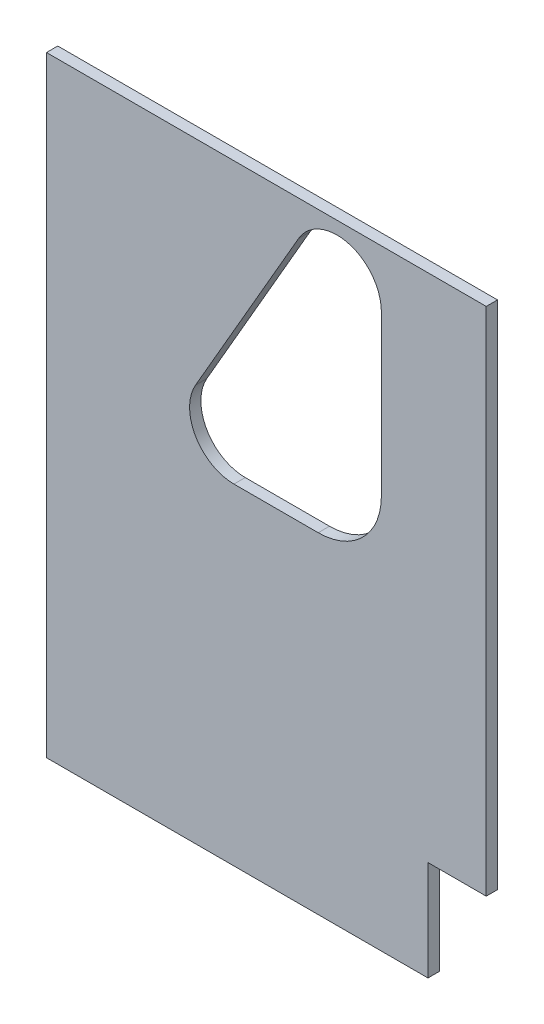
ISO-10303-21;
HEADER;
FILE_DESCRIPTION(('STEP AP214'),'2;1');
FILE_NAME('part.step','',(''),(''),'','','');
FILE_SCHEMA(('AUTOMOTIVE_DESIGN { 1 0 10303 214 1 1 1 1 }'));
ENDSEC;
DATA;
#1=APPLICATION_CONTEXT('core data for automotive mechanical design processes');
#2=APPLICATION_PROTOCOL_DEFINITION('international standard','automotive_design',2000,#1);
#3=PRODUCT_CONTEXT('',#1,'mechanical');
#4=PRODUCT('Part','Part','',(#3));
#5=PRODUCT_RELATED_PRODUCT_CATEGORY('part','',(#4));
#6=PRODUCT_DEFINITION_FORMATION('','',#4);
#7=PRODUCT_DEFINITION_CONTEXT('part definition',#1,'design');
#8=PRODUCT_DEFINITION('design','',#6,#7);
#9=PRODUCT_DEFINITION_SHAPE('','',#8);
#10=(LENGTH_UNIT() NAMED_UNIT(*) SI_UNIT(.MILLI.,.METRE.));
#11=(NAMED_UNIT(*) PLANE_ANGLE_UNIT() SI_UNIT($,.RADIAN.));
#12=(NAMED_UNIT(*) SI_UNIT($,.STERADIAN.) SOLID_ANGLE_UNIT());
#13=UNCERTAINTY_MEASURE_WITH_UNIT(LENGTH_MEASURE(1.E-05),#10,'distance_accuracy_value','');
#14=(GEOMETRIC_REPRESENTATION_CONTEXT(3) GLOBAL_UNCERTAINTY_ASSIGNED_CONTEXT((#13)) GLOBAL_UNIT_ASSIGNED_CONTEXT((#10,
#11,#12)) REPRESENTATION_CONTEXT('',''));
#15=CARTESIAN_POINT('',(0.,0.,0.));
#16=DIRECTION('',(0.,0.,1.));
#17=DIRECTION('',(1.,0.,0.));
#18=AXIS2_PLACEMENT_3D('',#15,#16,#17);
#19=CARTESIAN_POINT('',(0.,0.,30.));
#20=DIRECTION('',(1.,0.,0.));
#21=DIRECTION('',(0.,1.,0.));
#22=AXIS2_PLACEMENT_3D('',#19,#20,#21);
#23=PLANE('',#22);
#24=DIRECTION('',(0.,-1.,0.));
#25=VECTOR('',#24,1.);
#26=CARTESIAN_POINT('',(0.,0.,0.));
#27=LINE('',#26,#25);
#28=CARTESIAN_POINT('',(-4.44089209850063E-13,1625.,0.));
#29=VERTEX_POINT('',#28);
#30=CARTESIAN_POINT('',(0.,0.,0.));
#31=VERTEX_POINT('',#30);
#32=EDGE_CURVE('E184',#29,#31,#27,.T.);
#33=ORIENTED_EDGE('',*,*,#32,.T.);
#34=DIRECTION('',(0.,0.,-1.));
#35=VECTOR('',#34,1.);
#36=CARTESIAN_POINT('',(0.,0.,30.));
#37=LINE('',#36,#35);
#38=CARTESIAN_POINT('',(0.,0.,30.));
#39=VERTEX_POINT('',#38);
#40=EDGE_CURVE('E11',#39,#31,#37,.T.);
#41=ORIENTED_EDGE('',*,*,#40,.F.);
#42=DIRECTION('',(0.,-1.,0.));
#43=VECTOR('',#42,1.);
#44=CARTESIAN_POINT('',(0.,0.,30.));
#45=LINE('',#44,#43);
#46=CARTESIAN_POINT('',(-4.44089209850063E-13,1625.,30.));
#47=VERTEX_POINT('',#46);
#48=EDGE_CURVE('E185',#47,#39,#45,.T.);
#49=ORIENTED_EDGE('',*,*,#48,.F.);
#50=DIRECTION('',(0.,0.,-1.));
#51=VECTOR('',#50,1.);
#52=CARTESIAN_POINT('',(-4.44089209850063E-13,1625.,30.));
#53=LINE('',#52,#51);
#54=EDGE_CURVE('E199',#47,#29,#53,.T.);
#55=ORIENTED_EDGE('',*,*,#54,.T.);
#56=EDGE_LOOP('',(#33,#41,#49,#55));
#57=FACE_BOUND('',#56,.T.);
#58=ADVANCED_FACE('F40',(#57),#23,.F.);
#59=CARTESIAN_POINT('',(0.,0.,30.));
#60=DIRECTION('',(0.,1.,0.));
#61=DIRECTION('',(-1.,0.,0.));
#62=AXIS2_PLACEMENT_3D('',#59,#60,#61);
#63=PLANE('',#62);
#64=DIRECTION('',(1.,0.,0.));
#65=VECTOR('',#64,1.);
#66=CARTESIAN_POINT('',(0.,0.,0.));
#67=LINE('',#66,#65);
#68=CARTESIAN_POINT('',(1015.,0.,0.));
#69=VERTEX_POINT('',#68);
#70=EDGE_CURVE('E202',#31,#69,#67,.T.);
#71=ORIENTED_EDGE('',*,*,#70,.T.);
#72=DIRECTION('',(0.,0.,-1.));
#73=VECTOR('',#72,1.);
#74=CARTESIAN_POINT('',(1015.,0.,30.));
#75=LINE('',#74,#73);
#76=CARTESIAN_POINT('',(1015.,0.,30.));
#77=VERTEX_POINT('',#76);
#78=EDGE_CURVE('E47',#77,#69,#75,.T.);
#79=ORIENTED_EDGE('',*,*,#78,.F.);
#80=DIRECTION('',(1.,0.,0.));
#81=VECTOR('',#80,1.);
#82=CARTESIAN_POINT('',(0.,0.,30.));
#83=LINE('',#82,#81);
#84=EDGE_CURVE('E188',#39,#77,#83,.T.);
#85=ORIENTED_EDGE('',*,*,#84,.F.);
#86=ORIENTED_EDGE('',*,*,#40,.T.);
#87=EDGE_LOOP('',(#71,#79,#85,#86));
#88=FACE_BOUND('',#87,.T.);
#89=ADVANCED_FACE('F247',(#88),#63,.F.);
#90=CARTESIAN_POINT('',(1015.,266.,30.));
#91=DIRECTION('',(-1.,0.,0.));
#92=DIRECTION('',(0.,0.,1.));
#93=AXIS2_PLACEMENT_3D('',#90,#91,#92);
#94=PLANE('',#93);
#95=DIRECTION('',(0.,1.,0.));
#96=VECTOR('',#95,1.);
#97=CARTESIAN_POINT('',(1015.,266.,0.));
#98=LINE('',#97,#96);
#99=CARTESIAN_POINT('',(1015.,266.,0.));
#100=VERTEX_POINT('',#99);
#101=EDGE_CURVE('E204',#69,#100,#98,.T.);
#102=ORIENTED_EDGE('',*,*,#101,.T.);
#103=DIRECTION('',(0.,0.,-1.));
#104=VECTOR('',#103,1.);
#105=CARTESIAN_POINT('',(1015.,266.,30.));
#106=LINE('',#105,#104);
#107=CARTESIAN_POINT('',(1015.,266.,30.));
#108=VERTEX_POINT('',#107);
#109=EDGE_CURVE('E219',#108,#100,#106,.T.);
#110=ORIENTED_EDGE('',*,*,#109,.F.);
#111=DIRECTION('',(0.,1.,0.));
#112=VECTOR('',#111,1.);
#113=CARTESIAN_POINT('',(1015.,266.,30.));
#114=LINE('',#113,#112);
#115=EDGE_CURVE('E191',#77,#108,#114,.T.);
#116=ORIENTED_EDGE('',*,*,#115,.F.);
#117=ORIENTED_EDGE('',*,*,#78,.T.);
#118=EDGE_LOOP('',(#102,#110,#116,#117));
#119=FACE_BOUND('',#118,.T.);
#120=ADVANCED_FACE('F226',(#119),#94,.F.);
#121=CARTESIAN_POINT('',(1170.,266.,30.));
#122=DIRECTION('',(0.,1.,0.));
#123=DIRECTION('',(0.,0.,1.));
#124=AXIS2_PLACEMENT_3D('',#121,#122,#123);
#125=PLANE('',#124);
#126=DIRECTION('',(1.,0.,0.));
#127=VECTOR('',#126,1.);
#128=CARTESIAN_POINT('',(1170.,266.,0.));
#129=LINE('',#128,#127);
#130=CARTESIAN_POINT('',(1170.,266.,0.));
#131=VERTEX_POINT('',#130);
#132=EDGE_CURVE('E206',#100,#131,#129,.T.);
#133=ORIENTED_EDGE('',*,*,#132,.T.);
#134=DIRECTION('',(0.,0.,-1.));
#135=VECTOR('',#134,1.);
#136=CARTESIAN_POINT('',(1170.,266.,30.));
#137=LINE('',#136,#135);
#138=CARTESIAN_POINT('',(1170.,266.,30.));
#139=VERTEX_POINT('',#138);
#140=EDGE_CURVE('E216',#139,#131,#137,.T.);
#141=ORIENTED_EDGE('',*,*,#140,.F.);
#142=DIRECTION('',(1.,0.,0.));
#143=VECTOR('',#142,1.);
#144=CARTESIAN_POINT('',(1170.,266.,30.));
#145=LINE('',#144,#143);
#146=EDGE_CURVE('E193',#108,#139,#145,.T.);
#147=ORIENTED_EDGE('',*,*,#146,.F.);
#148=ORIENTED_EDGE('',*,*,#109,.T.);
#149=EDGE_LOOP('',(#133,#141,#147,#148));
#150=FACE_BOUND('',#149,.T.);
#151=ADVANCED_FACE('F235',(#150),#125,.F.);
#152=CARTESIAN_POINT('',(1170.,266.,30.));
#153=DIRECTION('',(-1.,0.,0.));
#154=DIRECTION('',(0.,-1.,0.));
#155=AXIS2_PLACEMENT_3D('',#152,#153,#154);
#156=PLANE('',#155);
#157=DIRECTION('',(0.,1.,0.));
#158=VECTOR('',#157,1.);
#159=CARTESIAN_POINT('',(1170.,266.,0.));
#160=LINE('',#159,#158);
#161=CARTESIAN_POINT('',(1170.,1625.,0.));
#162=VERTEX_POINT('',#161);
#163=EDGE_CURVE('E208',#131,#162,#160,.T.);
#164=ORIENTED_EDGE('',*,*,#163,.T.);
#165=DIRECTION('',(0.,0.,-1.));
#166=VECTOR('',#165,1.);
#167=CARTESIAN_POINT('',(1170.,1625.,30.));
#168=LINE('',#167,#166);
#169=CARTESIAN_POINT('',(1170.,1625.,30.));
#170=VERTEX_POINT('',#169);
#171=EDGE_CURVE('E213',#170,#162,#168,.T.);
#172=ORIENTED_EDGE('',*,*,#171,.F.);
#173=DIRECTION('',(0.,1.,0.));
#174=VECTOR('',#173,1.);
#175=CARTESIAN_POINT('',(1170.,266.,30.));
#176=LINE('',#175,#174);
#177=EDGE_CURVE('E195',#139,#170,#176,.T.);
#178=ORIENTED_EDGE('',*,*,#177,.F.);
#179=ORIENTED_EDGE('',*,*,#140,.T.);
#180=EDGE_LOOP('',(#164,#172,#178,#179));
#181=FACE_BOUND('',#180,.T.);
#182=ADVANCED_FACE('F239',(#181),#156,.F.);
#183=CARTESIAN_POINT('',(-4.44089209850063E-13,1625.,30.));
#184=DIRECTION('',(0.,-1.,0.));
#185=DIRECTION('',(0.,0.,-1.));
#186=AXIS2_PLACEMENT_3D('',#183,#184,#185);
#187=PLANE('',#186);
#188=DIRECTION('',(-1.,0.,0.));
#189=VECTOR('',#188,1.);
#190=CARTESIAN_POINT('',(-4.44089209850063E-13,1625.,0.));
#191=LINE('',#190,#189);
#192=EDGE_CURVE('E189',#162,#29,#191,.T.);
#193=ORIENTED_EDGE('',*,*,#192,.T.);
#194=ORIENTED_EDGE('',*,*,#54,.F.);
#195=DIRECTION('',(-1.,0.,0.));
#196=VECTOR('',#195,1.);
#197=CARTESIAN_POINT('',(-4.44089209850063E-13,1625.,30.));
#198=LINE('',#197,#196);
#199=EDGE_CURVE('E197',#170,#47,#198,.T.);
#200=ORIENTED_EDGE('',*,*,#199,.F.);
#201=ORIENTED_EDGE('',*,*,#171,.T.);
#202=EDGE_LOOP('',(#193,#194,#200,#201));
#203=FACE_BOUND('',#202,.T.);
#204=ADVANCED_FACE('F250',(#203),#187,.F.);
#205=CARTESIAN_POINT('',(0.,0.,30.));
#206=DIRECTION('',(0.,0.,-1.));
#207=DIRECTION('',(-1.,0.,0.));
#208=AXIS2_PLACEMENT_3D('',#205,#206,#207);
#209=PLANE('',#208);
#210=DIRECTION('',(0.,-1.,0.));
#211=VECTOR('',#210,1.);
#212=CARTESIAN_POINT('',(891.,0.,30.));
#213=LINE('',#212,#211);
#214=CARTESIAN_POINT('',(891.,1473.,30.));
#215=VERTEX_POINT('',#214);
#216=CARTESIAN_POINT('',(891.,1048.,30.));
#217=VERTEX_POINT('',#216);
#218=EDGE_CURVE('E159',#215,#217,#213,.T.);
#219=ORIENTED_EDGE('',*,*,#218,.T.);
#220=CARTESIAN_POINT('',(723.,1048.,30.));
#221=DIRECTION('',(0.,0.,-1.));
#222=DIRECTION('',(-1.,0.,0.));
#223=AXIS2_PLACEMENT_3D('',#220,#221,#222);
#224=CIRCLE('',#223,168.);
#225=CARTESIAN_POINT('',(723.,880.,30.));
#226=VERTEX_POINT('',#225);
#227=EDGE_CURVE('E134',#217,#226,#224,.T.);
#228=ORIENTED_EDGE('',*,*,#227,.T.);
#229=DIRECTION('',(-1.,0.,0.));
#230=VECTOR('',#229,1.);
#231=CARTESIAN_POINT('',(0.,880.,30.));
#232=LINE('',#231,#230);
#233=CARTESIAN_POINT('',(498.758622134924,880.,30.));
#234=VERTEX_POINT('',#233);
#235=EDGE_CURVE('E180',#226,#234,#232,.T.);
#236=ORIENTED_EDGE('',*,*,#235,.T.);
#237=CARTESIAN_POINT('',(498.758622134924,998.,30.));
#238=DIRECTION('',(0.,0.,-1.));
#239=DIRECTION('',(-1.,0.,0.));
#240=AXIS2_PLACEMENT_3D('',#237,#238,#239);
#241=CIRCLE('',#240,118.);
#242=CARTESIAN_POINT('',(396.567624488361,1057.,30.));
#243=VERTEX_POINT('',#242);
#244=EDGE_CURVE('E177',#234,#243,#241,.T.);
#245=ORIENTED_EDGE('',*,*,#244,.T.);
#246=DIRECTION('',(0.500000000000004,0.866025403784436,0.));
#247=VECTOR('',#246,1.);
#248=CARTESIAN_POINT('',(-160.26870753381,92.5311814373195,30.));
#249=LINE('',#248,#247);
#250=CARTESIAN_POINT('',(670.809002353436,1532.,30.));
#251=VERTEX_POINT('',#250);
#252=EDGE_CURVE('E174',#243,#251,#249,.T.);
#253=ORIENTED_EDGE('',*,*,#252,.T.);
#254=CARTESIAN_POINT('',(773.,1473.,30.));
#255=DIRECTION('',(0.,0.,-1.));
#256=DIRECTION('',(-1.,0.,0.));
#257=AXIS2_PLACEMENT_3D('',#254,#255,#256);
#258=CIRCLE('',#257,118.);
#259=EDGE_CURVE('E171',#251,#215,#258,.T.);
#260=ORIENTED_EDGE('',*,*,#259,.T.);
#261=EDGE_LOOP('',(#219,#228,#236,#245,#253,#260));
#262=FACE_BOUND('',#261,.T.);
#263=ORIENTED_EDGE('',*,*,#48,.T.);
#264=ORIENTED_EDGE('',*,*,#84,.T.);
#265=ORIENTED_EDGE('',*,*,#115,.T.);
#266=ORIENTED_EDGE('',*,*,#146,.T.);
#267=ORIENTED_EDGE('',*,*,#177,.T.);
#268=ORIENTED_EDGE('',*,*,#199,.T.);
#269=EDGE_LOOP('',(#263,#264,#265,#266,#267,#268));
#270=FACE_BOUND('',#269,.T.);
#271=ADVANCED_FACE('F243',(#262,#270),#209,.F.);
#272=CARTESIAN_POINT('',(0.,0.,0.));
#273=DIRECTION('',(0.,0.,-1.));
#274=DIRECTION('',(-1.,0.,0.));
#275=AXIS2_PLACEMENT_3D('',#272,#273,#274);
#276=PLANE('',#275);
#277=CARTESIAN_POINT('',(723.,1048.,0.));
#278=DIRECTION('',(0.,0.,1.));
#279=DIRECTION('',(-1.,0.,0.));
#280=AXIS2_PLACEMENT_3D('',#277,#278,#279);
#281=CIRCLE('',#280,168.);
#282=CARTESIAN_POINT('',(723.,880.,0.));
#283=VERTEX_POINT('',#282);
#284=CARTESIAN_POINT('',(891.,1048.,0.));
#285=VERTEX_POINT('',#284);
#286=EDGE_CURVE('E131',#283,#285,#281,.T.);
#287=ORIENTED_EDGE('',*,*,#286,.T.);
#288=DIRECTION('',(0.,1.,0.));
#289=VECTOR('',#288,1.);
#290=CARTESIAN_POINT('',(891.,1473.,0.));
#291=LINE('',#290,#289);
#292=CARTESIAN_POINT('',(891.,1473.,0.));
#293=VERTEX_POINT('',#292);
#294=EDGE_CURVE('E140',#285,#293,#291,.T.);
#295=ORIENTED_EDGE('',*,*,#294,.T.);
#296=CARTESIAN_POINT('',(773.,1473.,0.));
#297=DIRECTION('',(0.,0.,1.));
#298=DIRECTION('',(1.,0.,0.));
#299=AXIS2_PLACEMENT_3D('',#296,#297,#298);
#300=CIRCLE('',#299,118.);
#301=CARTESIAN_POINT('',(670.809002353436,1532.,0.));
#302=VERTEX_POINT('',#301);
#303=EDGE_CURVE('E62',#293,#302,#300,.T.);
#304=ORIENTED_EDGE('',*,*,#303,.T.);
#305=DIRECTION('',(-0.500000000000004,-0.866025403784436,0.));
#306=VECTOR('',#305,1.);
#307=CARTESIAN_POINT('',(396.567624488361,1057.,0.));
#308=LINE('',#307,#306);
#309=CARTESIAN_POINT('',(396.567624488361,1057.,0.));
#310=VERTEX_POINT('',#309);
#311=EDGE_CURVE('E151',#302,#310,#308,.T.);
#312=ORIENTED_EDGE('',*,*,#311,.T.);
#313=CARTESIAN_POINT('',(498.758622134924,998.,0.));
#314=DIRECTION('',(0.,0.,1.));
#315=DIRECTION('',(-1.,0.,0.));
#316=AXIS2_PLACEMENT_3D('',#313,#314,#315);
#317=CIRCLE('',#316,118.);
#318=CARTESIAN_POINT('',(498.758622134924,880.,0.));
#319=VERTEX_POINT('',#318);
#320=EDGE_CURVE('E154',#310,#319,#317,.T.);
#321=ORIENTED_EDGE('',*,*,#320,.T.);
#322=DIRECTION('',(1.,0.,0.));
#323=VECTOR('',#322,1.);
#324=CARTESIAN_POINT('',(723.,880.,0.));
#325=LINE('',#324,#323);
#326=EDGE_CURVE('E137',#319,#283,#325,.T.);
#327=ORIENTED_EDGE('',*,*,#326,.T.);
#328=EDGE_LOOP('',(#287,#295,#304,#312,#321,#327));
#329=FACE_BOUND('',#328,.T.);
#330=ORIENTED_EDGE('',*,*,#32,.F.);
#331=ORIENTED_EDGE('',*,*,#192,.F.);
#332=ORIENTED_EDGE('',*,*,#163,.F.);
#333=ORIENTED_EDGE('',*,*,#132,.F.);
#334=ORIENTED_EDGE('',*,*,#101,.F.);
#335=ORIENTED_EDGE('',*,*,#70,.F.);
#336=EDGE_LOOP('',(#330,#331,#332,#333,#334,#335));
#337=FACE_BOUND('',#336,.T.);
#338=ADVANCED_FACE('F144',(#329,#337),#276,.T.);
#339=CARTESIAN_POINT('',(723.,1048.,0.));
#340=DIRECTION('',(0.,0.,1.));
#341=DIRECTION('',(1.,0.,0.));
#342=AXIS2_PLACEMENT_3D('',#339,#340,#341);
#343=CYLINDRICAL_SURFACE('',#342,168.);
#344=DIRECTION('',(0.,0.,1.));
#345=VECTOR('',#344,1.);
#346=CARTESIAN_POINT('',(891.,1048.,0.));
#347=LINE('',#346,#345);
#348=EDGE_CURVE('E54',#285,#217,#347,.T.);
#349=ORIENTED_EDGE('',*,*,#348,.F.);
#350=ORIENTED_EDGE('',*,*,#286,.F.);
#351=DIRECTION('',(0.,0.,1.));
#352=VECTOR('',#351,1.);
#353=CARTESIAN_POINT('',(723.,880.,0.));
#354=LINE('',#353,#352);
#355=EDGE_CURVE('E157',#283,#226,#354,.T.);
#356=ORIENTED_EDGE('',*,*,#355,.T.);
#357=ORIENTED_EDGE('',*,*,#227,.F.);
#358=EDGE_LOOP('',(#349,#350,#356,#357));
#359=FACE_BOUND('',#358,.T.);
#360=ADVANCED_FACE('F128',(#359),#343,.F.);
#361=CARTESIAN_POINT('',(723.,880.,0.));
#362=DIRECTION('',(0.,-1.,0.));
#363=DIRECTION('',(0.,0.,-1.));
#364=AXIS2_PLACEMENT_3D('',#361,#362,#363);
#365=PLANE('',#364);
#366=ORIENTED_EDGE('',*,*,#355,.F.);
#367=ORIENTED_EDGE('',*,*,#326,.F.);
#368=DIRECTION('',(0.,0.,1.));
#369=VECTOR('',#368,1.);
#370=CARTESIAN_POINT('',(498.758622134924,880.,0.));
#371=LINE('',#370,#369);
#372=EDGE_CURVE('E160',#319,#234,#371,.T.);
#373=ORIENTED_EDGE('',*,*,#372,.T.);
#374=ORIENTED_EDGE('',*,*,#235,.F.);
#375=EDGE_LOOP('',(#366,#367,#373,#374));
#376=FACE_BOUND('',#375,.T.);
#377=ADVANCED_FACE('F301',(#376),#365,.F.);
#378=CARTESIAN_POINT('',(498.758622134924,998.,0.));
#379=DIRECTION('',(0.,0.,1.));
#380=DIRECTION('',(1.,0.,0.));
#381=AXIS2_PLACEMENT_3D('',#378,#379,#380);
#382=CYLINDRICAL_SURFACE('',#381,118.);
#383=ORIENTED_EDGE('',*,*,#372,.F.);
#384=ORIENTED_EDGE('',*,*,#320,.F.);
#385=DIRECTION('',(0.,0.,1.));
#386=VECTOR('',#385,1.);
#387=CARTESIAN_POINT('',(396.567624488361,1057.,0.));
#388=LINE('',#387,#386);
#389=EDGE_CURVE('E163',#310,#243,#388,.T.);
#390=ORIENTED_EDGE('',*,*,#389,.T.);
#391=ORIENTED_EDGE('',*,*,#244,.F.);
#392=EDGE_LOOP('',(#383,#384,#390,#391));
#393=FACE_BOUND('',#392,.T.);
#394=ADVANCED_FACE('F310',(#393),#382,.F.);
#395=CARTESIAN_POINT('',(396.567624488361,1057.,0.));
#396=DIRECTION('',(-0.866025403784436,0.500000000000004,0.));
#397=DIRECTION('',(-0.500000000000004,-0.866025403784436,0.));
#398=AXIS2_PLACEMENT_3D('',#395,#396,#397);
#399=PLANE('',#398);
#400=ORIENTED_EDGE('',*,*,#389,.F.);
#401=ORIENTED_EDGE('',*,*,#311,.F.);
#402=DIRECTION('',(0.,0.,1.));
#403=VECTOR('',#402,1.);
#404=CARTESIAN_POINT('',(670.809002353436,1532.,0.));
#405=LINE('',#404,#403);
#406=EDGE_CURVE('E166',#302,#251,#405,.T.);
#407=ORIENTED_EDGE('',*,*,#406,.T.);
#408=ORIENTED_EDGE('',*,*,#252,.F.);
#409=EDGE_LOOP('',(#400,#401,#407,#408));
#410=FACE_BOUND('',#409,.T.);
#411=ADVANCED_FACE('F320',(#410),#399,.F.);
#412=CARTESIAN_POINT('',(773.,1473.,0.));
#413=DIRECTION('',(0.,0.,1.));
#414=DIRECTION('',(1.,0.,0.));
#415=AXIS2_PLACEMENT_3D('',#412,#413,#414);
#416=CYLINDRICAL_SURFACE('',#415,118.);
#417=ORIENTED_EDGE('',*,*,#406,.F.);
#418=ORIENTED_EDGE('',*,*,#303,.F.);
#419=DIRECTION('',(0.,0.,1.));
#420=VECTOR('',#419,1.);
#421=CARTESIAN_POINT('',(891.,1473.,0.));
#422=LINE('',#421,#420);
#423=EDGE_CURVE('E136',#293,#215,#422,.T.);
#424=ORIENTED_EDGE('',*,*,#423,.T.);
#425=ORIENTED_EDGE('',*,*,#259,.F.);
#426=EDGE_LOOP('',(#417,#418,#424,#425));
#427=FACE_BOUND('',#426,.T.);
#428=ADVANCED_FACE('F330',(#427),#416,.F.);
#429=CARTESIAN_POINT('',(891.,1473.,0.));
#430=DIRECTION('',(1.,0.,0.));
#431=DIRECTION('',(0.,0.,-1.));
#432=AXIS2_PLACEMENT_3D('',#429,#430,#431);
#433=PLANE('',#432);
#434=ORIENTED_EDGE('',*,*,#423,.F.);
#435=ORIENTED_EDGE('',*,*,#294,.F.);
#436=ORIENTED_EDGE('',*,*,#348,.T.);
#437=ORIENTED_EDGE('',*,*,#218,.F.);
#438=EDGE_LOOP('',(#434,#435,#436,#437));
#439=FACE_BOUND('',#438,.T.);
#440=ADVANCED_FACE('F141',(#439),#433,.F.);
#441=CLOSED_SHELL('',(#58,#89,#120,#151,#182,#204,#271,#338,#360,#377,#394,#411,#428,#440));
#442=MANIFOLD_SOLID_BREP('B2',#441);
#443=ADVANCED_BREP_SHAPE_REPRESENTATION('',(#18,#442),#14);
#444=SHAPE_DEFINITION_REPRESENTATION(#9,#443);
ENDSEC;
END-ISO-10303-21;
